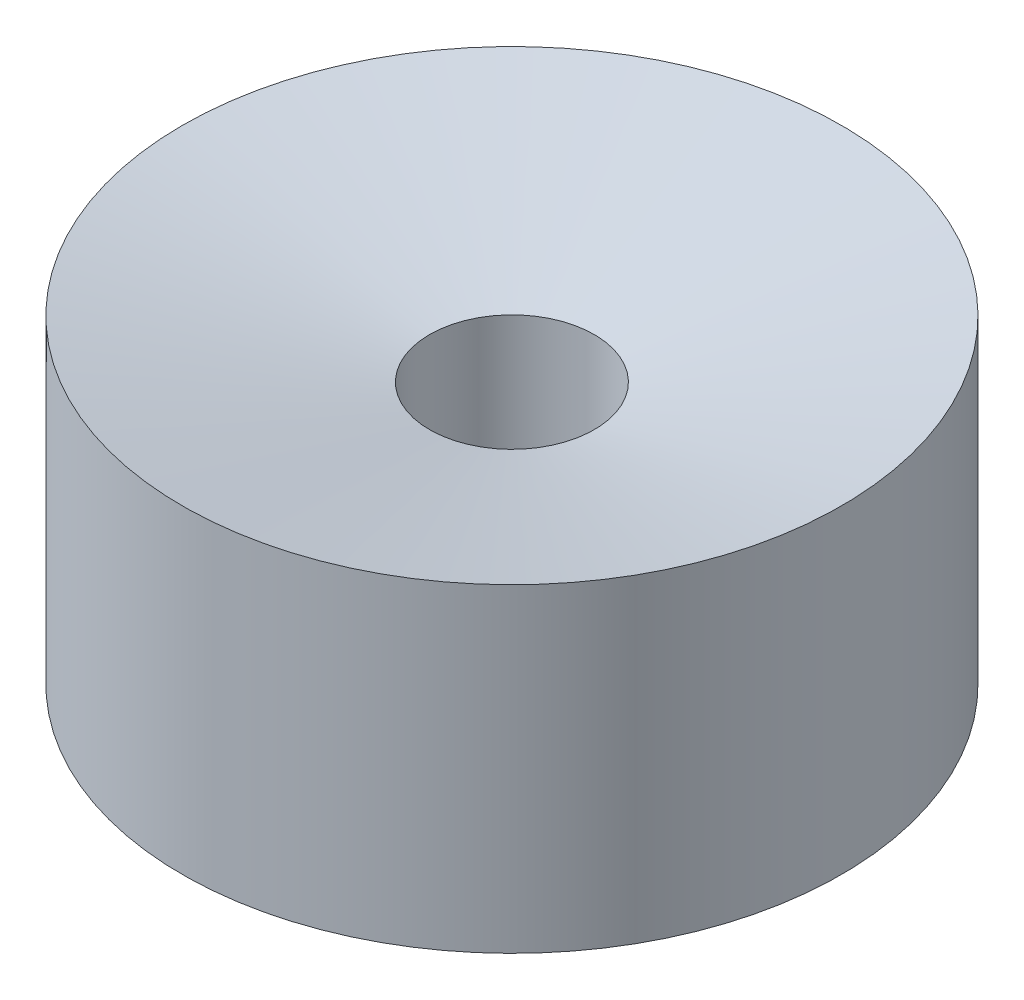
ISO-10303-21;
HEADER;
FILE_DESCRIPTION(('STEP AP214'),'2;1');
FILE_NAME('part.step','',(''),(''),'','','');
FILE_SCHEMA(('AUTOMOTIVE_DESIGN { 1 0 10303 214 1 1 1 1 }'));
ENDSEC;
DATA;
#1=APPLICATION_CONTEXT('core data for automotive mechanical design processes');
#2=APPLICATION_PROTOCOL_DEFINITION('international standard','automotive_design',2000,#1);
#3=PRODUCT_CONTEXT('',#1,'mechanical');
#4=PRODUCT('Part','Part','',(#3));
#5=PRODUCT_RELATED_PRODUCT_CATEGORY('part','',(#4));
#6=PRODUCT_DEFINITION_FORMATION('','',#4);
#7=PRODUCT_DEFINITION_CONTEXT('part definition',#1,'design');
#8=PRODUCT_DEFINITION('design','',#6,#7);
#9=PRODUCT_DEFINITION_SHAPE('','',#8);
#10=(LENGTH_UNIT() NAMED_UNIT(*) SI_UNIT(.MILLI.,.METRE.));
#11=(NAMED_UNIT(*) PLANE_ANGLE_UNIT() SI_UNIT($,.RADIAN.));
#12=(NAMED_UNIT(*) SI_UNIT($,.STERADIAN.) SOLID_ANGLE_UNIT());
#13=UNCERTAINTY_MEASURE_WITH_UNIT(LENGTH_MEASURE(1.E-05),#10,'distance_accuracy_value','');
#14=(GEOMETRIC_REPRESENTATION_CONTEXT(3) GLOBAL_UNCERTAINTY_ASSIGNED_CONTEXT((#13)) GLOBAL_UNIT_ASSIGNED_CONTEXT((#10,
#11,#12)) REPRESENTATION_CONTEXT('',''));
#15=CARTESIAN_POINT('',(0.,0.,0.));
#16=DIRECTION('',(0.,0.,1.));
#17=DIRECTION('',(1.,0.,0.));
#18=AXIS2_PLACEMENT_3D('',#15,#16,#17);
#19=CARTESIAN_POINT('',(0.,0.,0.));
#20=DIRECTION('',(0.,1.,0.));
#21=DIRECTION('',(-1.,0.,0.));
#22=AXIS2_PLACEMENT_3D('',#19,#20,#21);
#23=PLANE('',#22);
#24=CARTESIAN_POINT('',(0.,0.,0.));
#25=DIRECTION('',(0.,1.,0.));
#26=DIRECTION('',(-1.,0.,0.));
#27=AXIS2_PLACEMENT_3D('',#24,#25,#26);
#28=CIRCLE('',#27,0.275);
#29=CARTESIAN_POINT('',(-0.275,0.,0.));
#30=VERTEX_POINT('',#29);
#31=EDGE_CURVE('E84',#30,#30,#28,.F.);
#32=ORIENTED_EDGE('',*,*,#31,.F.);
#33=EDGE_LOOP('',(#32));
#34=FACE_BOUND('',#33,.T.);
#35=CARTESIAN_POINT('',(0.,0.,0.));
#36=DIRECTION('',(0.,1.,0.));
#37=DIRECTION('',(-1.,0.,0.));
#38=AXIS2_PLACEMENT_3D('',#35,#36,#37);
#39=CIRCLE('',#38,0.7);
#40=CARTESIAN_POINT('',(-0.7,0.,0.));
#41=VERTEX_POINT('',#40);
#42=EDGE_CURVE('E10',#41,#41,#39,.T.);
#43=ORIENTED_EDGE('',*,*,#42,.F.);
#44=EDGE_LOOP('',(#43));
#45=FACE_BOUND('',#44,.T.);
#46=ADVANCED_FACE('F37',(#34,#45),#23,.F.);
#47=CARTESIAN_POINT('',(0.,0.15,0.));
#48=DIRECTION('',(0.,1.,0.));
#49=DIRECTION('',(-1.,0.,0.));
#50=AXIS2_PLACEMENT_3D('',#47,#48,#49);
#51=CYLINDRICAL_SURFACE('',#50,0.7);
#52=CARTESIAN_POINT('',(0.,0.819692267422241,0.));
#53=DIRECTION('',(0.,1.,0.));
#54=DIRECTION('',(-1.,0.,0.));
#55=AXIS2_PLACEMENT_3D('',#52,#53,#54);
#56=CIRCLE('',#55,0.7);
#57=CARTESIAN_POINT('',(-0.7,0.819692267422241,0.));
#58=VERTEX_POINT('',#57);
#59=EDGE_CURVE('E44',#58,#58,#56,.T.);
#60=ORIENTED_EDGE('',*,*,#59,.F.);
#61=EDGE_LOOP('',(#60));
#62=FACE_BOUND('',#61,.T.);
#63=ORIENTED_EDGE('',*,*,#42,.T.);
#64=EDGE_LOOP('',(#63));
#65=FACE_BOUND('',#64,.T.);
#66=ADVANCED_FACE('F146',(#62,#65),#51,.T.);
#67=CARTESIAN_POINT('',(1.14,0.819692267422241,0.));
#68=DIRECTION('',(0.,1.,0.));
#69=DIRECTION('',(-1.,0.,0.));
#70=AXIS2_PLACEMENT_3D('',#67,#68,#69);
#71=PLANE('',#70);
#72=CARTESIAN_POINT('',(0.,0.819692267422241,0.));
#73=DIRECTION('',(0.,1.,0.));
#74=DIRECTION('',(-1.,0.,0.));
#75=AXIS2_PLACEMENT_3D('',#72,#73,#74);
#76=CIRCLE('',#75,1.28);
#77=CARTESIAN_POINT('',(-1.28,0.819692267422241,0.));
#78=VERTEX_POINT('',#77);
#79=EDGE_CURVE('E49',#78,#78,#76,.T.);
#80=ORIENTED_EDGE('',*,*,#79,.F.);
#81=EDGE_LOOP('',(#80));
#82=FACE_BOUND('',#81,.T.);
#83=ORIENTED_EDGE('',*,*,#59,.T.);
#84=EDGE_LOOP('',(#83));
#85=FACE_BOUND('',#84,.T.);
#86=ADVANCED_FACE('F141',(#82,#85),#71,.F.);
#87=CARTESIAN_POINT('',(0.,0.15,0.));
#88=DIRECTION('',(0.,1.,0.));
#89=DIRECTION('',(-1.,0.,0.));
#90=AXIS2_PLACEMENT_3D('',#87,#88,#89);
#91=CYLINDRICAL_SURFACE('',#90,1.28);
#92=CARTESIAN_POINT('',(0.,0.519692267422241,0.));
#93=DIRECTION('',(0.,1.,0.));
#94=DIRECTION('',(-1.,0.,0.));
#95=AXIS2_PLACEMENT_3D('',#92,#93,#94);
#96=CIRCLE('',#95,1.28);
#97=CARTESIAN_POINT('',(-1.28,0.519692267422241,0.));
#98=VERTEX_POINT('',#97);
#99=EDGE_CURVE('E54',#98,#98,#96,.T.);
#100=ORIENTED_EDGE('',*,*,#99,.F.);
#101=EDGE_LOOP('',(#100));
#102=FACE_BOUND('',#101,.T.);
#103=ORIENTED_EDGE('',*,*,#79,.T.);
#104=EDGE_LOOP('',(#103));
#105=FACE_BOUND('',#104,.T.);
#106=ADVANCED_FACE('F135',(#102,#105),#91,.F.);
#107=CARTESIAN_POINT('',(1.28,0.519692267422241,0.));
#108=DIRECTION('',(0.,-1.,0.));
#109=DIRECTION('',(1.,0.,0.));
#110=AXIS2_PLACEMENT_3D('',#107,#108,#109);
#111=PLANE('',#110);
#112=CARTESIAN_POINT('',(0.,0.519692267422241,0.));
#113=DIRECTION('',(0.,1.,0.));
#114=DIRECTION('',(-1.,0.,0.));
#115=AXIS2_PLACEMENT_3D('',#112,#113,#114);
#116=CIRCLE('',#115,1.14);
#117=CARTESIAN_POINT('',(-1.14,0.519692267422241,0.));
#118=VERTEX_POINT('',#117);
#119=EDGE_CURVE('E60',#118,#118,#116,.T.);
#120=ORIENTED_EDGE('',*,*,#119,.F.);
#121=EDGE_LOOP('',(#120));
#122=FACE_BOUND('',#121,.T.);
#123=ORIENTED_EDGE('',*,*,#99,.T.);
#124=EDGE_LOOP('',(#123));
#125=FACE_BOUND('',#124,.T.);
#126=ADVANCED_FACE('F129',(#122,#125),#111,.F.);
#127=CARTESIAN_POINT('',(0.,0.15,0.));
#128=DIRECTION('',(0.,1.,0.));
#129=DIRECTION('',(-1.,0.,0.));
#130=AXIS2_PLACEMENT_3D('',#127,#128,#129);
#131=CYLINDRICAL_SURFACE('',#130,1.14);
#132=CARTESIAN_POINT('',(0.,-0.33,0.));
#133=DIRECTION('',(0.,1.,0.));
#134=DIRECTION('',(-1.,0.,0.));
#135=AXIS2_PLACEMENT_3D('',#132,#133,#134);
#136=CIRCLE('',#135,1.14);
#137=CARTESIAN_POINT('',(-1.14,-0.33,0.));
#138=VERTEX_POINT('',#137);
#139=EDGE_CURVE('E64',#138,#138,#136,.T.);
#140=ORIENTED_EDGE('',*,*,#139,.F.);
#141=EDGE_LOOP('',(#140));
#142=FACE_BOUND('',#141,.T.);
#143=ORIENTED_EDGE('',*,*,#119,.T.);
#144=EDGE_LOOP('',(#143));
#145=FACE_BOUND('',#144,.T.);
#146=ADVANCED_FACE('F123',(#142,#145),#131,.F.);
#147=CARTESIAN_POINT('',(1.14,-0.33,0.));
#148=DIRECTION('',(0.,1.,0.));
#149=DIRECTION('',(-1.,0.,0.));
#150=AXIS2_PLACEMENT_3D('',#147,#148,#149);
#151=PLANE('',#150);
#152=CARTESIAN_POINT('',(0.,-0.33,0.));
#153=DIRECTION('',(0.,1.,0.));
#154=DIRECTION('',(-1.,0.,0.));
#155=AXIS2_PLACEMENT_3D('',#152,#153,#154);
#156=CIRCLE('',#155,1.6);
#157=CARTESIAN_POINT('',(-1.6,-0.33,0.));
#158=VERTEX_POINT('',#157);
#159=EDGE_CURVE('E68',#158,#158,#156,.T.);
#160=ORIENTED_EDGE('',*,*,#159,.F.);
#161=EDGE_LOOP('',(#160));
#162=FACE_BOUND('',#161,.T.);
#163=ORIENTED_EDGE('',*,*,#139,.T.);
#164=EDGE_LOOP('',(#163));
#165=FACE_BOUND('',#164,.T.);
#166=ADVANCED_FACE('F117',(#162,#165),#151,.F.);
#167=CARTESIAN_POINT('',(0.,0.15,0.));
#168=DIRECTION('',(0.,1.,0.));
#169=DIRECTION('',(-1.,0.,0.));
#170=AXIS2_PLACEMENT_3D('',#167,#168,#169);
#171=CYLINDRICAL_SURFACE('',#170,1.6);
#172=CARTESIAN_POINT('',(0.,1.22,0.));
#173=DIRECTION('',(0.,1.,0.));
#174=DIRECTION('',(-1.,0.,0.));
#175=AXIS2_PLACEMENT_3D('',#172,#173,#174);
#176=CIRCLE('',#175,1.6);
#177=CARTESIAN_POINT('',(-1.6,1.22,0.));
#178=VERTEX_POINT('',#177);
#179=EDGE_CURVE('E72',#178,#178,#176,.T.);
#180=ORIENTED_EDGE('',*,*,#179,.F.);
#181=EDGE_LOOP('',(#180));
#182=FACE_BOUND('',#181,.T.);
#183=ORIENTED_EDGE('',*,*,#159,.T.);
#184=EDGE_LOOP('',(#183));
#185=FACE_BOUND('',#184,.T.);
#186=ADVANCED_FACE('F111',(#182,#185),#171,.T.);
#187=CARTESIAN_POINT('',(0.,1.22,0.));
#188=DIRECTION('',(0.,1.,0.));
#189=DIRECTION('',(-1.,0.,0.));
#190=AXIS2_PLACEMENT_3D('',#187,#188,#189);
#191=CONICAL_SURFACE('',#190,1.6,1.3420096823325);
#192=CARTESIAN_POINT('',(0.,0.94056338028169,0.));
#193=DIRECTION('',(0.,1.,0.));
#194=DIRECTION('',(-1.,0.,0.));
#195=AXIS2_PLACEMENT_3D('',#192,#193,#194);
#196=CIRCLE('',#195,0.4);
#197=CARTESIAN_POINT('',(-0.400000000000001,0.94056338028169,0.));
#198=VERTEX_POINT('',#197);
#199=EDGE_CURVE('E76',#198,#198,#196,.T.);
#200=CARTESIAN_POINT('',(-0.400000000000001,0.94056338028169,0.));
#201=CARTESIAN_POINT('',(-0.412500000000001,0.943474178403756,0.));
#202=CARTESIAN_POINT('',(-0.425000000000001,0.946384976525822,0.));
#203=CARTESIAN_POINT('',(-0.450000000000001,0.952206572769953,0.));
#204=CARTESIAN_POINT('',(-0.462500000000001,0.955117370892019,0.));
#205=CARTESIAN_POINT('',(-0.487500000000001,0.96093896713615,0.));
#206=CARTESIAN_POINT('',(-0.500000000000001,0.963849765258216,0.));
#207=CARTESIAN_POINT('',(-0.525000000000001,0.969671361502348,0.));
#208=CARTESIAN_POINT('',(-0.537500000000001,0.972582159624413,0.));
#209=CARTESIAN_POINT('',(-0.562500000000001,0.978403755868545,0.));
#210=CARTESIAN_POINT('',(-0.575000000000001,0.981314553990611,0.));
#211=CARTESIAN_POINT('',(-0.600000000000001,0.987136150234742,0.));
#212=CARTESIAN_POINT('',(-0.612500000000001,0.990046948356808,0.));
#213=CARTESIAN_POINT('',(-0.637500000000001,0.995868544600939,0.));
#214=CARTESIAN_POINT('',(-0.65,0.998779342723005,0.));
#215=CARTESIAN_POINT('',(-0.675,1.00460093896714,0.));
#216=CARTESIAN_POINT('',(-0.687500000000001,1.0075117370892,0.));
#217=CARTESIAN_POINT('',(-0.7125,1.01333333333333,0.));
#218=CARTESIAN_POINT('',(-0.725,1.0162441314554,0.));
#219=CARTESIAN_POINT('',(-0.75,1.02206572769953,0.));
#220=CARTESIAN_POINT('',(-0.7625,1.0249765258216,0.));
#221=CARTESIAN_POINT('',(-0.7875,1.03079812206573,0.));
#222=CARTESIAN_POINT('',(-0.8,1.03370892018779,0.));
#223=CARTESIAN_POINT('',(-0.825,1.03953051643192,0.));
#224=CARTESIAN_POINT('',(-0.8375,1.04244131455399,0.));
#225=CARTESIAN_POINT('',(-0.8625,1.04826291079812,0.));
#226=CARTESIAN_POINT('',(-0.875,1.05117370892019,0.));
#227=CARTESIAN_POINT('',(-0.9,1.05699530516432,0.));
#228=CARTESIAN_POINT('',(-0.9125,1.05990610328639,0.));
#229=CARTESIAN_POINT('',(-0.9375,1.06572769953052,0.));
#230=CARTESIAN_POINT('',(-0.95,1.06863849765258,0.));
#231=CARTESIAN_POINT('',(-0.975,1.07446009389671,0.));
#232=CARTESIAN_POINT('',(-0.9875,1.07737089201878,0.));
#233=CARTESIAN_POINT('',(-1.0125,1.08319248826291,0.));
#234=CARTESIAN_POINT('',(-1.025,1.08610328638498,0.));
#235=CARTESIAN_POINT('',(-1.05,1.09192488262911,0.));
#236=CARTESIAN_POINT('',(-1.0625,1.09483568075117,0.));
#237=CARTESIAN_POINT('',(-1.0875,1.10065727699531,0.));
#238=CARTESIAN_POINT('',(-1.1,1.10356807511737,0.));
#239=CARTESIAN_POINT('',(-1.125,1.1093896713615,0.));
#240=CARTESIAN_POINT('',(-1.1375,1.11230046948357,0.));
#241=CARTESIAN_POINT('',(-1.1625,1.1181220657277,0.));
#242=CARTESIAN_POINT('',(-1.175,1.12103286384977,0.));
#243=CARTESIAN_POINT('',(-1.2,1.1268544600939,0.));
#244=CARTESIAN_POINT('',(-1.2125,1.12976525821596,0.));
#245=CARTESIAN_POINT('',(-1.2375,1.13558685446009,0.));
#246=CARTESIAN_POINT('',(-1.25,1.13849765258216,0.));
#247=CARTESIAN_POINT('',(-1.275,1.14431924882629,0.));
#248=CARTESIAN_POINT('',(-1.2875,1.14723004694836,0.));
#249=CARTESIAN_POINT('',(-1.3125,1.15305164319249,0.));
#250=CARTESIAN_POINT('',(-1.325,1.15596244131455,0.));
#251=CARTESIAN_POINT('',(-1.35,1.16178403755869,0.));
#252=CARTESIAN_POINT('',(-1.3625,1.16469483568075,0.));
#253=CARTESIAN_POINT('',(-1.3875,1.17051643192488,0.));
#254=CARTESIAN_POINT('',(-1.4,1.17342723004695,0.));
#255=CARTESIAN_POINT('',(-1.425,1.17924882629108,0.));
#256=CARTESIAN_POINT('',(-1.4375,1.18215962441315,0.));
#257=CARTESIAN_POINT('',(-1.4625,1.18798122065728,0.));
#258=CARTESIAN_POINT('',(-1.475,1.19089201877934,0.));
#259=CARTESIAN_POINT('',(-1.5,1.19671361502347,0.));
#260=CARTESIAN_POINT('',(-1.5125,1.19962441314554,0.));
#261=CARTESIAN_POINT('',(-1.5375,1.20544600938967,0.));
#262=CARTESIAN_POINT('',(-1.55,1.20835680751174,0.));
#263=CARTESIAN_POINT('',(-1.575,1.21417840375587,0.));
#264=CARTESIAN_POINT('',(-1.5875,1.21708920187793,0.));
#265=CARTESIAN_POINT('',(-1.6,1.22,0.));
#266=B_SPLINE_CURVE_WITH_KNOTS('',3,(#200,#201,#202,#203,#204,#205,#206,#207,#208,#209,#210,
#211,#212,#213,#214,#215,#216,#217,#218,#219,#220,#221,#222,#223,#224,#225,#226,#227,#228,#229,
#230,#231,#232,#233,#234,#235,#236,#237,#238,#239,#240,#241,#242,#243,#244,#245,#246,#247,#248,
#249,#250,#251,#252,#253,#254,#255,#256,#257,#258,#259,#260,#261,#262,#263,#264,#265),
.UNSPECIFIED.,.F.,.F.,(4,2,2,2,2,2,2,2,2,2,2,2,2,2,2,2,2,2,2,2,2,2,2,2,2,2,2,2,2,2,2,2,4),(0.,
0.0385033077977305,0.0770066155954612,0.115509923393192,0.154013231190923,0.192516538988653,
0.231019846786384,0.269523154584115,0.308026462381845,0.346529770179576,0.385033077977307,
0.423536385775037,0.462039693572768,0.500543001370499,0.539046309168229,0.57754961696596,
0.61605292476369,0.654556232561421,0.693059540359152,0.731562848156883,0.770066155954613,
0.808569463752344,0.847072771550075,0.885576079347805,0.924079387145536,0.962582694943267,
1.001086002741,1.03958931053873,1.07809261833646,1.11659592613419,1.15509923393192,
1.19360254172965,1.23210584952738),.UNSPECIFIED.);
#267=EDGE_CURVE('BSEAM105',#198,#178,#266,.T.);
#268=ORIENTED_EDGE('',*,*,#199,.F.);
#269=ORIENTED_EDGE('',*,*,#179,.T.);
#270=ORIENTED_EDGE('',*,*,#267,.T.);
#271=ORIENTED_EDGE('',*,*,#267,.F.);
#272=EDGE_LOOP('',(#268,#270,#269,#271));
#273=FACE_BOUND('',#272,.T.);
#274=ADVANCED_FACE('F105',(#273),#191,.F.);
#275=CARTESIAN_POINT('',(0.,0.15,0.));
#276=DIRECTION('',(0.,1.,0.));
#277=DIRECTION('',(-1.,0.,0.));
#278=AXIS2_PLACEMENT_3D('',#275,#276,#277);
#279=CYLINDRICAL_SURFACE('',#278,0.4);
#280=CARTESIAN_POINT('',(0.,0.15,0.));
#281=DIRECTION('',(0.,1.,0.));
#282=DIRECTION('',(-1.,0.,0.));
#283=AXIS2_PLACEMENT_3D('',#280,#281,#282);
#284=CIRCLE('',#283,0.4);
#285=CARTESIAN_POINT('',(-0.4,0.15,0.));
#286=VERTEX_POINT('',#285);
#287=EDGE_CURVE('E80',#286,#286,#284,.T.);
#288=ORIENTED_EDGE('',*,*,#287,.F.);
#289=EDGE_LOOP('',(#288));
#290=FACE_BOUND('',#289,.T.);
#291=ORIENTED_EDGE('',*,*,#199,.T.);
#292=EDGE_LOOP('',(#291));
#293=FACE_BOUND('',#292,.T.);
#294=ADVANCED_FACE('F99',(#290,#293),#279,.F.);
#295=CARTESIAN_POINT('',(0.4,0.15,0.));
#296=DIRECTION('',(0.,-1.,0.));
#297=DIRECTION('',(1.,0.,0.));
#298=AXIS2_PLACEMENT_3D('',#295,#296,#297);
#299=PLANE('',#298);
#300=CARTESIAN_POINT('',(0.,0.15,0.));
#301=DIRECTION('',(0.,1.,0.));
#302=DIRECTION('',(-1.,0.,0.));
#303=AXIS2_PLACEMENT_3D('',#300,#301,#302);
#304=CIRCLE('',#303,0.275);
#305=CARTESIAN_POINT('',(-0.275,0.15,0.));
#306=VERTEX_POINT('',#305);
#307=EDGE_CURVE('E88',#306,#306,#304,.T.);
#308=ORIENTED_EDGE('',*,*,#307,.F.);
#309=EDGE_LOOP('',(#308));
#310=FACE_BOUND('',#309,.T.);
#311=ORIENTED_EDGE('',*,*,#287,.T.);
#312=EDGE_LOOP('',(#311));
#313=FACE_BOUND('',#312,.T.);
#314=ADVANCED_FACE('F96',(#310,#313),#299,.F.);
#315=CARTESIAN_POINT('',(0.,-0.331,0.));
#316=DIRECTION('',(0.,1.,0.));
#317=DIRECTION('',(-1.,0.,0.));
#318=AXIS2_PLACEMENT_3D('',#315,#316,#317);
#319=CYLINDRICAL_SURFACE('',#318,0.275);
#320=ORIENTED_EDGE('',*,*,#307,.T.);
#321=EDGE_LOOP('',(#320));
#322=FACE_BOUND('',#321,.T.);
#323=ORIENTED_EDGE('',*,*,#31,.T.);
#324=EDGE_LOOP('',(#323));
#325=FACE_BOUND('',#324,.T.);
#326=ADVANCED_FACE('F93',(#322,#325),#319,.F.);
#327=CLOSED_SHELL('',(#46,#66,#86,#106,#126,#146,#166,#186,#274,#294,#314,#326));
#328=MANIFOLD_SOLID_BREP('B2',#327);
#329=ADVANCED_BREP_SHAPE_REPRESENTATION('',(#18,#328),#14);
#330=SHAPE_DEFINITION_REPRESENTATION(#9,#329);
ENDSEC;
END-ISO-10303-21;
